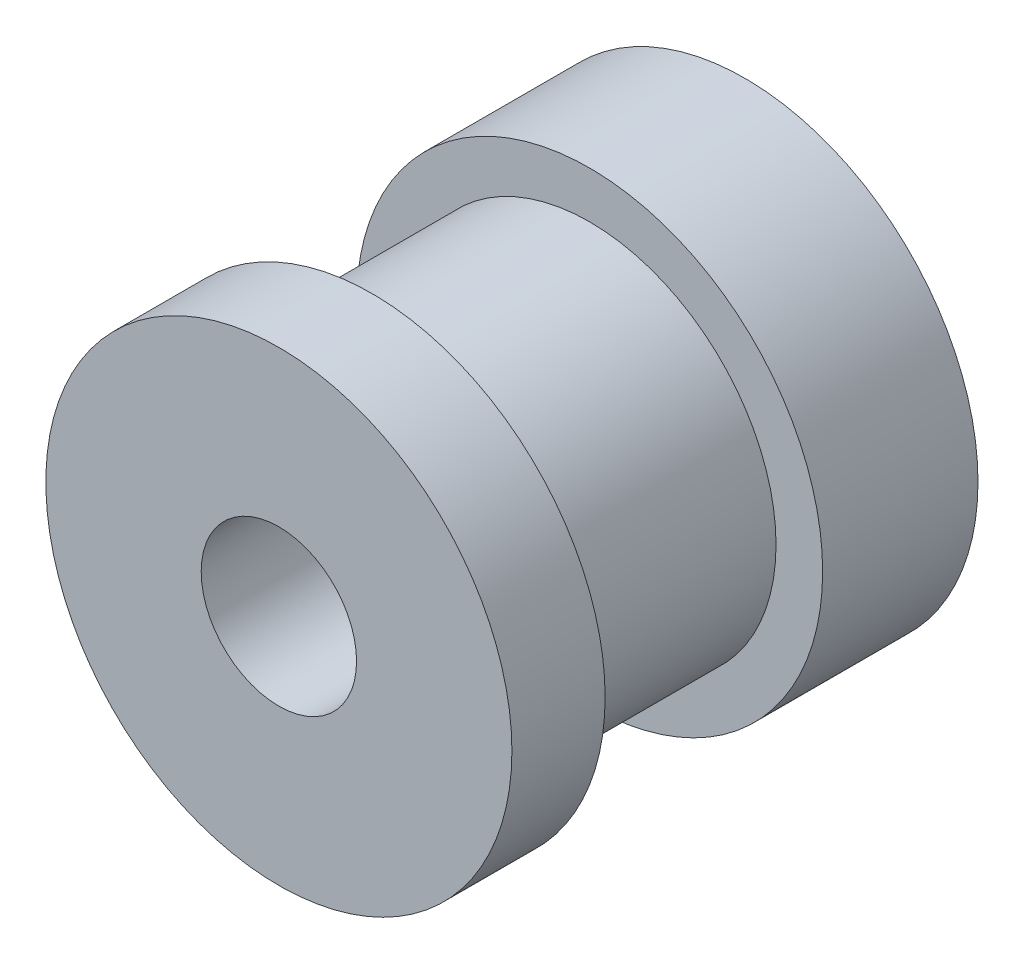
ISO-10303-21;
HEADER;
FILE_DESCRIPTION(('STEP AP214'),'2;1');
FILE_NAME('part.step','',(''),(''),'','','');
FILE_SCHEMA(('AUTOMOTIVE_DESIGN { 1 0 10303 214 1 1 1 1 }'));
ENDSEC;
DATA;
#1=APPLICATION_CONTEXT('core data for automotive mechanical design processes');
#2=APPLICATION_PROTOCOL_DEFINITION('international standard','automotive_design',2000,#1);
#3=PRODUCT_CONTEXT('',#1,'mechanical');
#4=PRODUCT('Part','Part','',(#3));
#5=PRODUCT_RELATED_PRODUCT_CATEGORY('part','',(#4));
#6=PRODUCT_DEFINITION_FORMATION('','',#4);
#7=PRODUCT_DEFINITION_CONTEXT('part definition',#1,'design');
#8=PRODUCT_DEFINITION('design','',#6,#7);
#9=PRODUCT_DEFINITION_SHAPE('','',#8);
#10=(LENGTH_UNIT() NAMED_UNIT(*) SI_UNIT(.MILLI.,.METRE.));
#11=(NAMED_UNIT(*) PLANE_ANGLE_UNIT() SI_UNIT($,.RADIAN.));
#12=(NAMED_UNIT(*) SI_UNIT($,.STERADIAN.) SOLID_ANGLE_UNIT());
#13=UNCERTAINTY_MEASURE_WITH_UNIT(LENGTH_MEASURE(1.E-05),#10,'distance_accuracy_value','');
#14=(GEOMETRIC_REPRESENTATION_CONTEXT(3) GLOBAL_UNCERTAINTY_ASSIGNED_CONTEXT((#13)) GLOBAL_UNIT_ASSIGNED_CONTEXT((#10,
#11,#12)) REPRESENTATION_CONTEXT('',''));
#15=CARTESIAN_POINT('',(0.,0.,0.));
#16=DIRECTION('',(0.,0.,1.));
#17=DIRECTION('',(1.,0.,0.));
#18=AXIS2_PLACEMENT_3D('',#15,#16,#17);
#19=CARTESIAN_POINT('',(0.,0.,5.));
#20=DIRECTION('',(0.,0.,-1.));
#21=DIRECTION('',(-1.,0.,0.));
#22=AXIS2_PLACEMENT_3D('',#19,#20,#21);
#23=CYLINDRICAL_SURFACE('',#22,7.5);
#24=CARTESIAN_POINT('',(0.,0.,5.));
#25=DIRECTION('',(0.,0.,1.));
#26=DIRECTION('',(1.,0.,0.));
#27=AXIS2_PLACEMENT_3D('',#24,#25,#26);
#28=CIRCLE('',#27,7.5);
#29=CARTESIAN_POINT('',(7.5,0.,5.));
#30=VERTEX_POINT('',#29);
#31=EDGE_CURVE('E10',#30,#30,#28,.T.);
#32=ORIENTED_EDGE('',*,*,#31,.F.);
#33=EDGE_LOOP('',(#32));
#34=FACE_BOUND('',#33,.T.);
#35=CARTESIAN_POINT('',(0.,0.,0.));
#36=DIRECTION('',(0.,0.,1.));
#37=DIRECTION('',(1.,0.,0.));
#38=AXIS2_PLACEMENT_3D('',#35,#36,#37);
#39=CIRCLE('',#38,7.5);
#40=CARTESIAN_POINT('',(7.5,0.,0.));
#41=VERTEX_POINT('',#40);
#42=EDGE_CURVE('E38',#41,#41,#39,.T.);
#43=ORIENTED_EDGE('',*,*,#42,.T.);
#44=EDGE_LOOP('',(#43));
#45=FACE_BOUND('',#44,.T.);
#46=ADVANCED_FACE('F31',(#34,#45),#23,.T.);
#47=CARTESIAN_POINT('',(0.,0.,5.));
#48=DIRECTION('',(0.,0.,1.));
#49=DIRECTION('',(1.,0.,0.));
#50=AXIS2_PLACEMENT_3D('',#47,#48,#49);
#51=PLANE('',#50);
#52=CARTESIAN_POINT('',(0.,0.,5.));
#53=DIRECTION('',(0.,0.,1.));
#54=DIRECTION('',(1.,0.,0.));
#55=AXIS2_PLACEMENT_3D('',#52,#53,#54);
#56=CIRCLE('',#55,6.);
#57=CARTESIAN_POINT('',(6.,0.,5.));
#58=VERTEX_POINT('',#57);
#59=EDGE_CURVE('E45',#58,#58,#56,.T.);
#60=ORIENTED_EDGE('',*,*,#59,.F.);
#61=EDGE_LOOP('',(#60));
#62=FACE_BOUND('',#61,.T.);
#63=ORIENTED_EDGE('',*,*,#31,.T.);
#64=EDGE_LOOP('',(#63));
#65=FACE_BOUND('',#64,.T.);
#66=ADVANCED_FACE('F87',(#62,#65),#51,.T.);
#67=CARTESIAN_POINT('',(0.,0.,0.));
#68=DIRECTION('',(0.,0.,1.));
#69=DIRECTION('',(1.,0.,0.));
#70=AXIS2_PLACEMENT_3D('',#67,#68,#69);
#71=PLANE('',#70);
#72=CARTESIAN_POINT('',(0.,0.,0.));
#73=DIRECTION('',(0.,0.,-1.));
#74=DIRECTION('',(-1.,0.,0.));
#75=AXIS2_PLACEMENT_3D('',#72,#73,#74);
#76=CIRCLE('',#75,2.5);
#77=CARTESIAN_POINT('',(-2.5,0.,0.));
#78=VERTEX_POINT('',#77);
#79=EDGE_CURVE('E56',#78,#78,#76,.T.);
#80=ORIENTED_EDGE('',*,*,#79,.F.);
#81=EDGE_LOOP('',(#80));
#82=FACE_BOUND('',#81,.T.);
#83=ORIENTED_EDGE('',*,*,#42,.F.);
#84=EDGE_LOOP('',(#83));
#85=FACE_BOUND('',#84,.T.);
#86=ADVANCED_FACE('F92',(#82,#85),#71,.F.);
#87=CARTESIAN_POINT('',(0.,0.,12.));
#88=DIRECTION('',(0.,0.,-1.));
#89=DIRECTION('',(-1.,0.,0.));
#90=AXIS2_PLACEMENT_3D('',#87,#88,#89);
#91=CYLINDRICAL_SURFACE('',#90,6.);
#92=CARTESIAN_POINT('',(0.,0.,12.));
#93=DIRECTION('',(0.,0.,1.));
#94=DIRECTION('',(1.,0.,0.));
#95=AXIS2_PLACEMENT_3D('',#92,#93,#94);
#96=CIRCLE('',#95,6.);
#97=CARTESIAN_POINT('',(6.,0.,12.));
#98=VERTEX_POINT('',#97);
#99=EDGE_CURVE('E43',#98,#98,#96,.T.);
#100=ORIENTED_EDGE('',*,*,#99,.F.);
#101=EDGE_LOOP('',(#100));
#102=FACE_BOUND('',#101,.T.);
#103=ORIENTED_EDGE('',*,*,#59,.T.);
#104=EDGE_LOOP('',(#103));
#105=FACE_BOUND('',#104,.T.);
#106=ADVANCED_FACE('F75',(#102,#105),#91,.T.);
#107=CARTESIAN_POINT('',(0.,0.,15.));
#108=DIRECTION('',(0.,0.,-1.));
#109=DIRECTION('',(-1.,0.,0.));
#110=AXIS2_PLACEMENT_3D('',#107,#108,#109);
#111=CYLINDRICAL_SURFACE('',#110,7.5);
#112=CARTESIAN_POINT('',(0.,0.,15.));
#113=DIRECTION('',(0.,0.,1.));
#114=DIRECTION('',(1.,0.,0.));
#115=AXIS2_PLACEMENT_3D('',#112,#113,#114);
#116=CIRCLE('',#115,7.5);
#117=CARTESIAN_POINT('',(7.5,0.,15.));
#118=VERTEX_POINT('',#117);
#119=EDGE_CURVE('E48',#118,#118,#116,.T.);
#120=ORIENTED_EDGE('',*,*,#119,.F.);
#121=EDGE_LOOP('',(#120));
#122=FACE_BOUND('',#121,.T.);
#123=CARTESIAN_POINT('',(0.,0.,12.));
#124=DIRECTION('',(0.,0.,1.));
#125=DIRECTION('',(1.,0.,0.));
#126=AXIS2_PLACEMENT_3D('',#123,#124,#125);
#127=CIRCLE('',#126,7.5);
#128=CARTESIAN_POINT('',(7.5,0.,12.));
#129=VERTEX_POINT('',#128);
#130=EDGE_CURVE('E51',#129,#129,#127,.T.);
#131=ORIENTED_EDGE('',*,*,#130,.T.);
#132=EDGE_LOOP('',(#131));
#133=FACE_BOUND('',#132,.T.);
#134=ADVANCED_FACE('F69',(#122,#133),#111,.T.);
#135=CARTESIAN_POINT('',(0.,0.,15.));
#136=DIRECTION('',(0.,0.,1.));
#137=DIRECTION('',(1.,0.,0.));
#138=AXIS2_PLACEMENT_3D('',#135,#136,#137);
#139=PLANE('',#138);
#140=CARTESIAN_POINT('',(0.,0.,15.));
#141=DIRECTION('',(0.,0.,1.));
#142=DIRECTION('',(1.,0.,0.));
#143=AXIS2_PLACEMENT_3D('',#140,#141,#142);
#144=CIRCLE('',#143,2.5);
#145=CARTESIAN_POINT('',(2.5,0.,15.));
#146=VERTEX_POINT('',#145);
#147=EDGE_CURVE('E34',#146,#146,#144,.T.);
#148=ORIENTED_EDGE('',*,*,#147,.F.);
#149=EDGE_LOOP('',(#148));
#150=FACE_BOUND('',#149,.T.);
#151=ORIENTED_EDGE('',*,*,#119,.T.);
#152=EDGE_LOOP('',(#151));
#153=FACE_BOUND('',#152,.T.);
#154=ADVANCED_FACE('F65',(#150,#153),#139,.T.);
#155=CARTESIAN_POINT('',(0.,0.,12.));
#156=DIRECTION('',(0.,0.,1.));
#157=DIRECTION('',(1.,0.,0.));
#158=AXIS2_PLACEMENT_3D('',#155,#156,#157);
#159=PLANE('',#158);
#160=ORIENTED_EDGE('',*,*,#99,.T.);
#161=EDGE_LOOP('',(#160));
#162=FACE_BOUND('',#161,.T.);
#163=ORIENTED_EDGE('',*,*,#130,.F.);
#164=EDGE_LOOP('',(#163));
#165=FACE_BOUND('',#164,.T.);
#166=ADVANCED_FACE('F68',(#162,#165),#159,.F.);
#167=CARTESIAN_POINT('',(0.,0.,30.));
#168=DIRECTION('',(0.,0.,-1.));
#169=DIRECTION('',(-1.,0.,0.));
#170=AXIS2_PLACEMENT_3D('',#167,#168,#169);
#171=CYLINDRICAL_SURFACE('',#170,2.5);
#172=ORIENTED_EDGE('',*,*,#147,.T.);
#173=EDGE_LOOP('',(#172));
#174=FACE_BOUND('',#173,.T.);
#175=ORIENTED_EDGE('',*,*,#79,.T.);
#176=EDGE_LOOP('',(#175));
#177=FACE_BOUND('',#176,.T.);
#178=ADVANCED_FACE('F63',(#174,#177),#171,.F.);
#179=CLOSED_SHELL('',(#46,#66,#86,#106,#134,#154,#166,#178));
#180=MANIFOLD_SOLID_BREP('B2',#179);
#181=ADVANCED_BREP_SHAPE_REPRESENTATION('',(#18,#180),#14);
#182=SHAPE_DEFINITION_REPRESENTATION(#9,#181);
ENDSEC;
END-ISO-10303-21;
